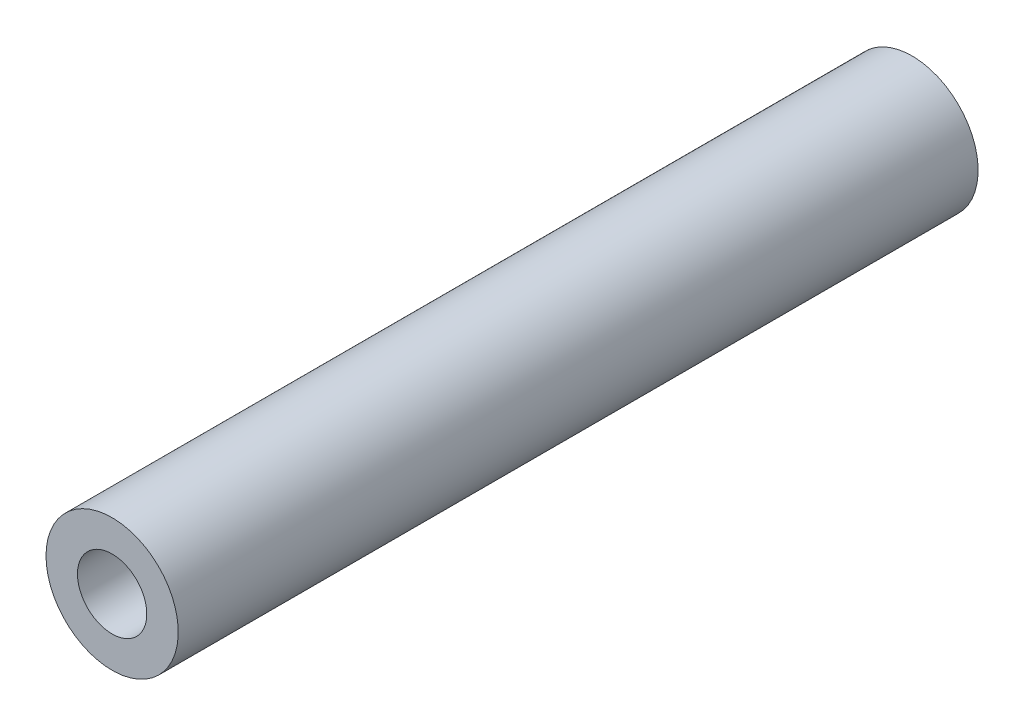
ISO-10303-21;
HEADER;
FILE_DESCRIPTION(('STEP AP214'),'2;1');
FILE_NAME('part.step','',(''),(''),'','','');
FILE_SCHEMA(('AUTOMOTIVE_DESIGN { 1 0 10303 214 1 1 1 1 }'));
ENDSEC;
DATA;
#1=APPLICATION_CONTEXT('core data for automotive mechanical design processes');
#2=APPLICATION_PROTOCOL_DEFINITION('international standard','automotive_design',2000,#1);
#3=PRODUCT_CONTEXT('',#1,'mechanical');
#4=PRODUCT('Part','Part','',(#3));
#5=PRODUCT_RELATED_PRODUCT_CATEGORY('part','',(#4));
#6=PRODUCT_DEFINITION_FORMATION('','',#4);
#7=PRODUCT_DEFINITION_CONTEXT('part definition',#1,'design');
#8=PRODUCT_DEFINITION('design','',#6,#7);
#9=PRODUCT_DEFINITION_SHAPE('','',#8);
#10=(LENGTH_UNIT() NAMED_UNIT(*) SI_UNIT(.MILLI.,.METRE.));
#11=(NAMED_UNIT(*) PLANE_ANGLE_UNIT() SI_UNIT($,.RADIAN.));
#12=(NAMED_UNIT(*) SI_UNIT($,.STERADIAN.) SOLID_ANGLE_UNIT());
#13=UNCERTAINTY_MEASURE_WITH_UNIT(LENGTH_MEASURE(1.E-05),#10,'distance_accuracy_value','');
#14=(GEOMETRIC_REPRESENTATION_CONTEXT(3) GLOBAL_UNCERTAINTY_ASSIGNED_CONTEXT((#13)) GLOBAL_UNIT_ASSIGNED_CONTEXT((#10,
#11,#12)) REPRESENTATION_CONTEXT('',''));
#15=CARTESIAN_POINT('',(0.,0.,0.));
#16=DIRECTION('',(0.,0.,1.));
#17=DIRECTION('',(1.,0.,0.));
#18=AXIS2_PLACEMENT_3D('',#15,#16,#17);
#19=CARTESIAN_POINT('',(0.,0.,19.05));
#20=DIRECTION('',(0.,0.,-1.));
#21=DIRECTION('',(-1.,0.,0.));
#22=AXIS2_PLACEMENT_3D('',#19,#20,#21);
#23=CYLINDRICAL_SURFACE('',#22,0.8255);
#24=CARTESIAN_POINT('',(0.,0.,19.05));
#25=DIRECTION('',(0.,0.,1.));
#26=DIRECTION('',(1.,0.,0.));
#27=AXIS2_PLACEMENT_3D('',#24,#25,#26);
#28=CIRCLE('',#27,0.8255);
#29=CARTESIAN_POINT('',(-0.8255,0.,19.05));
#30=VERTEX_POINT('',#29);
#31=EDGE_CURVE('E41',#30,#30,#28,.T.);
#32=CARTESIAN_POINT('',(0.,0.,0.));
#33=DIRECTION('',(0.,0.,1.));
#34=DIRECTION('',(1.,0.,0.));
#35=AXIS2_PLACEMENT_3D('',#32,#33,#34);
#36=CIRCLE('',#35,0.8255);
#37=CARTESIAN_POINT('',(-0.8255,0.,0.));
#38=VERTEX_POINT('',#37);
#39=EDGE_CURVE('E47',#38,#38,#36,.T.);
#40=CARTESIAN_POINT('',(-0.8255,0.,19.05));
#41=CARTESIAN_POINT('',(-0.8255,0.,18.8515625));
#42=CARTESIAN_POINT('',(-0.8255,0.,18.653125));
#43=CARTESIAN_POINT('',(-0.8255,0.,18.25625));
#44=CARTESIAN_POINT('',(-0.8255,0.,18.0578125));
#45=CARTESIAN_POINT('',(-0.8255,0.,17.6609375));
#46=CARTESIAN_POINT('',(-0.8255,0.,17.4625));
#47=CARTESIAN_POINT('',(-0.8255,0.,17.065625));
#48=CARTESIAN_POINT('',(-0.8255,0.,16.8671875));
#49=CARTESIAN_POINT('',(-0.8255,0.,16.4703125));
#50=CARTESIAN_POINT('',(-0.8255,0.,16.271875));
#51=CARTESIAN_POINT('',(-0.8255,0.,15.875));
#52=CARTESIAN_POINT('',(-0.8255,0.,15.6765625));
#53=CARTESIAN_POINT('',(-0.8255,0.,15.2796875));
#54=CARTESIAN_POINT('',(-0.8255,0.,15.08125));
#55=CARTESIAN_POINT('',(-0.8255,0.,14.684375));
#56=CARTESIAN_POINT('',(-0.8255,0.,14.4859375));
#57=CARTESIAN_POINT('',(-0.8255,0.,14.0890625));
#58=CARTESIAN_POINT('',(-0.8255,0.,13.890625));
#59=CARTESIAN_POINT('',(-0.8255,0.,13.49375));
#60=CARTESIAN_POINT('',(-0.8255,0.,13.2953125));
#61=CARTESIAN_POINT('',(-0.8255,0.,12.8984375));
#62=CARTESIAN_POINT('',(-0.8255,0.,12.7));
#63=CARTESIAN_POINT('',(-0.8255,0.,12.303125));
#64=CARTESIAN_POINT('',(-0.8255,0.,12.1046875));
#65=CARTESIAN_POINT('',(-0.8255,0.,11.7078125));
#66=CARTESIAN_POINT('',(-0.8255,0.,11.509375));
#67=CARTESIAN_POINT('',(-0.8255,0.,11.1125));
#68=CARTESIAN_POINT('',(-0.8255,0.,10.9140625));
#69=CARTESIAN_POINT('',(-0.8255,0.,10.5171875));
#70=CARTESIAN_POINT('',(-0.8255,0.,10.31875));
#71=CARTESIAN_POINT('',(-0.8255,0.,9.921875));
#72=CARTESIAN_POINT('',(-0.8255,0.,9.7234375));
#73=CARTESIAN_POINT('',(-0.8255,0.,9.3265625));
#74=CARTESIAN_POINT('',(-0.8255,0.,9.128125));
#75=CARTESIAN_POINT('',(-0.8255,0.,8.73125));
#76=CARTESIAN_POINT('',(-0.8255,0.,8.5328125));
#77=CARTESIAN_POINT('',(-0.8255,0.,8.1359375));
#78=CARTESIAN_POINT('',(-0.8255,0.,7.9375));
#79=CARTESIAN_POINT('',(-0.8255,0.,7.540625));
#80=CARTESIAN_POINT('',(-0.8255,0.,7.3421875));
#81=CARTESIAN_POINT('',(-0.8255,0.,6.9453125));
#82=CARTESIAN_POINT('',(-0.8255,0.,6.746875));
#83=CARTESIAN_POINT('',(-0.8255,0.,6.35));
#84=CARTESIAN_POINT('',(-0.8255,0.,6.1515625));
#85=CARTESIAN_POINT('',(-0.8255,0.,5.7546875));
#86=CARTESIAN_POINT('',(-0.8255,0.,5.55625));
#87=CARTESIAN_POINT('',(-0.8255,0.,5.159375));
#88=CARTESIAN_POINT('',(-0.8255,0.,4.9609375));
#89=CARTESIAN_POINT('',(-0.8255,0.,4.5640625));
#90=CARTESIAN_POINT('',(-0.8255,0.,4.365625));
#91=CARTESIAN_POINT('',(-0.8255,0.,3.96875));
#92=CARTESIAN_POINT('',(-0.8255,0.,3.7703125));
#93=CARTESIAN_POINT('',(-0.8255,0.,3.3734375));
#94=CARTESIAN_POINT('',(-0.8255,0.,3.175));
#95=CARTESIAN_POINT('',(-0.8255,0.,2.778125));
#96=CARTESIAN_POINT('',(-0.8255,0.,2.5796875));
#97=CARTESIAN_POINT('',(-0.8255,0.,2.1828125));
#98=CARTESIAN_POINT('',(-0.8255,0.,1.984375));
#99=CARTESIAN_POINT('',(-0.8255,0.,1.5875));
#100=CARTESIAN_POINT('',(-0.8255,0.,1.3890625));
#101=CARTESIAN_POINT('',(-0.8255,0.,0.992187500000001));
#102=CARTESIAN_POINT('',(-0.8255,0.,0.793750000000001));
#103=CARTESIAN_POINT('',(-0.8255,0.,0.396875));
#104=CARTESIAN_POINT('',(-0.8255,0.,0.1984375));
#105=CARTESIAN_POINT('',(-0.8255,0.,0.));
#106=B_SPLINE_CURVE_WITH_KNOTS('',3,(#40,#41,#42,#43,#44,#45,#46,#47,#48,#49,#50,#51,#52,#53,
#54,#55,#56,#57,#58,#59,#60,#61,#62,#63,#64,#65,#66,#67,#68,#69,#70,#71,#72,#73,#74,#75,#76,#77,
#78,#79,#80,#81,#82,#83,#84,#85,#86,#87,#88,#89,#90,#91,#92,#93,#94,#95,#96,#97,#98,#99,#100,
#101,#102,#103,#104,#105),.UNSPECIFIED.,.F.,.F.,(4,2,2,2,2,2,2,2,2,2,2,2,2,2,2,2,2,2,2,2,2,2,2,
2,2,2,2,2,2,2,2,2,4),(0.,0.5953125,1.190625,1.7859375,2.38125,2.9765625,3.571875,4.1671875,
4.7625,5.3578125,5.953125,6.5484375,7.14375,7.7390625,8.334375,8.9296875,9.525,10.1203125,
10.715625,11.3109375,11.90625,12.5015625,13.096875,13.6921875,14.2875,14.8828125,15.478125,
16.0734375,16.66875,17.2640625,17.859375,18.4546875,19.05),.UNSPECIFIED.);
#107=EDGE_CURVE('BSEAM34',#30,#38,#106,.T.);
#108=ORIENTED_EDGE('',*,*,#31,.T.);
#109=ORIENTED_EDGE('',*,*,#39,.F.);
#110=ORIENTED_EDGE('',*,*,#107,.T.);
#111=ORIENTED_EDGE('',*,*,#107,.F.);
#112=EDGE_LOOP('',(#108,#110,#109,#111));
#113=FACE_BOUND('',#112,.T.);
#114=ADVANCED_FACE('F34',(#113),#23,.F.);
#115=CARTESIAN_POINT('',(0.,0.,19.05));
#116=DIRECTION('',(0.,0.,-1.));
#117=DIRECTION('',(-1.,0.,0.));
#118=AXIS2_PLACEMENT_3D('',#115,#116,#117);
#119=CYLINDRICAL_SURFACE('',#118,1.5748);
#120=CARTESIAN_POINT('',(0.,0.,19.05));
#121=DIRECTION('',(0.,0.,1.));
#122=DIRECTION('',(1.,0.,0.));
#123=AXIS2_PLACEMENT_3D('',#120,#121,#122);
#124=CIRCLE('',#123,1.5748);
#125=CARTESIAN_POINT('',(-1.5748,0.,19.05));
#126=VERTEX_POINT('',#125);
#127=EDGE_CURVE('E10',#126,#126,#124,.T.);
#128=CARTESIAN_POINT('',(0.,0.,0.));
#129=DIRECTION('',(0.,0.,1.));
#130=DIRECTION('',(1.,0.,0.));
#131=AXIS2_PLACEMENT_3D('',#128,#129,#130);
#132=CIRCLE('',#131,1.5748);
#133=CARTESIAN_POINT('',(-1.5748,0.,0.));
#134=VERTEX_POINT('',#133);
#135=EDGE_CURVE('E37',#134,#134,#132,.T.);
#136=CARTESIAN_POINT('',(-1.5748,0.,19.05));
#137=CARTESIAN_POINT('',(-1.5748,0.,18.8515625));
#138=CARTESIAN_POINT('',(-1.5748,0.,18.653125));
#139=CARTESIAN_POINT('',(-1.5748,0.,18.25625));
#140=CARTESIAN_POINT('',(-1.5748,0.,18.0578125));
#141=CARTESIAN_POINT('',(-1.5748,0.,17.6609375));
#142=CARTESIAN_POINT('',(-1.5748,0.,17.4625));
#143=CARTESIAN_POINT('',(-1.5748,0.,17.065625));
#144=CARTESIAN_POINT('',(-1.5748,0.,16.8671875));
#145=CARTESIAN_POINT('',(-1.5748,0.,16.4703125));
#146=CARTESIAN_POINT('',(-1.5748,0.,16.271875));
#147=CARTESIAN_POINT('',(-1.5748,0.,15.875));
#148=CARTESIAN_POINT('',(-1.5748,0.,15.6765625));
#149=CARTESIAN_POINT('',(-1.5748,0.,15.2796875));
#150=CARTESIAN_POINT('',(-1.5748,0.,15.08125));
#151=CARTESIAN_POINT('',(-1.5748,0.,14.684375));
#152=CARTESIAN_POINT('',(-1.5748,0.,14.4859375));
#153=CARTESIAN_POINT('',(-1.5748,0.,14.0890625));
#154=CARTESIAN_POINT('',(-1.5748,0.,13.890625));
#155=CARTESIAN_POINT('',(-1.5748,0.,13.49375));
#156=CARTESIAN_POINT('',(-1.5748,0.,13.2953125));
#157=CARTESIAN_POINT('',(-1.5748,0.,12.8984375));
#158=CARTESIAN_POINT('',(-1.5748,0.,12.7));
#159=CARTESIAN_POINT('',(-1.5748,0.,12.303125));
#160=CARTESIAN_POINT('',(-1.5748,0.,12.1046875));
#161=CARTESIAN_POINT('',(-1.5748,0.,11.7078125));
#162=CARTESIAN_POINT('',(-1.5748,0.,11.509375));
#163=CARTESIAN_POINT('',(-1.5748,0.,11.1125));
#164=CARTESIAN_POINT('',(-1.5748,0.,10.9140625));
#165=CARTESIAN_POINT('',(-1.5748,0.,10.5171875));
#166=CARTESIAN_POINT('',(-1.5748,0.,10.31875));
#167=CARTESIAN_POINT('',(-1.5748,0.,9.921875));
#168=CARTESIAN_POINT('',(-1.5748,0.,9.7234375));
#169=CARTESIAN_POINT('',(-1.5748,0.,9.3265625));
#170=CARTESIAN_POINT('',(-1.5748,0.,9.128125));
#171=CARTESIAN_POINT('',(-1.5748,0.,8.73125));
#172=CARTESIAN_POINT('',(-1.5748,0.,8.5328125));
#173=CARTESIAN_POINT('',(-1.5748,0.,8.1359375));
#174=CARTESIAN_POINT('',(-1.5748,0.,7.9375));
#175=CARTESIAN_POINT('',(-1.5748,0.,7.540625));
#176=CARTESIAN_POINT('',(-1.5748,0.,7.3421875));
#177=CARTESIAN_POINT('',(-1.5748,0.,6.9453125));
#178=CARTESIAN_POINT('',(-1.5748,0.,6.746875));
#179=CARTESIAN_POINT('',(-1.5748,0.,6.35));
#180=CARTESIAN_POINT('',(-1.5748,0.,6.1515625));
#181=CARTESIAN_POINT('',(-1.5748,0.,5.7546875));
#182=CARTESIAN_POINT('',(-1.5748,0.,5.55625));
#183=CARTESIAN_POINT('',(-1.5748,0.,5.159375));
#184=CARTESIAN_POINT('',(-1.5748,0.,4.9609375));
#185=CARTESIAN_POINT('',(-1.5748,0.,4.5640625));
#186=CARTESIAN_POINT('',(-1.5748,0.,4.365625));
#187=CARTESIAN_POINT('',(-1.5748,0.,3.96875));
#188=CARTESIAN_POINT('',(-1.5748,0.,3.7703125));
#189=CARTESIAN_POINT('',(-1.5748,0.,3.3734375));
#190=CARTESIAN_POINT('',(-1.5748,0.,3.175));
#191=CARTESIAN_POINT('',(-1.5748,0.,2.778125));
#192=CARTESIAN_POINT('',(-1.5748,0.,2.5796875));
#193=CARTESIAN_POINT('',(-1.5748,0.,2.1828125));
#194=CARTESIAN_POINT('',(-1.5748,0.,1.984375));
#195=CARTESIAN_POINT('',(-1.5748,0.,1.5875));
#196=CARTESIAN_POINT('',(-1.5748,0.,1.3890625));
#197=CARTESIAN_POINT('',(-1.5748,0.,0.992187500000001));
#198=CARTESIAN_POINT('',(-1.5748,0.,0.793750000000001));
#199=CARTESIAN_POINT('',(-1.5748,0.,0.396875));
#200=CARTESIAN_POINT('',(-1.5748,0.,0.1984375));
#201=CARTESIAN_POINT('',(-1.5748,0.,0.));
#202=B_SPLINE_CURVE_WITH_KNOTS('',3,(#136,#137,#138,#139,#140,#141,#142,#143,#144,#145,#146,
#147,#148,#149,#150,#151,#152,#153,#154,#155,#156,#157,#158,#159,#160,#161,#162,#163,#164,#165,
#166,#167,#168,#169,#170,#171,#172,#173,#174,#175,#176,#177,#178,#179,#180,#181,#182,#183,#184,
#185,#186,#187,#188,#189,#190,#191,#192,#193,#194,#195,#196,#197,#198,#199,#200,#201),
.UNSPECIFIED.,.F.,.F.,(4,2,2,2,2,2,2,2,2,2,2,2,2,2,2,2,2,2,2,2,2,2,2,2,2,2,2,2,2,2,2,2,4),(0.,
0.595312499999997,1.190625,1.7859375,2.38125,2.9765625,3.571875,4.1671875,4.7625,5.3578125,
5.953125,6.5484375,7.14375,7.7390625,8.334375,8.9296875,9.525,10.1203125,10.715625,11.3109375,
11.90625,12.5015625,13.096875,13.6921875,14.2875,14.8828125,15.478125,16.0734375,16.66875,
17.2640625,17.859375,18.4546875,19.05),.UNSPECIFIED.);
#203=EDGE_CURVE('BSEAM54',#126,#134,#202,.T.);
#204=ORIENTED_EDGE('',*,*,#127,.F.);
#205=ORIENTED_EDGE('',*,*,#135,.T.);
#206=ORIENTED_EDGE('',*,*,#203,.T.);
#207=ORIENTED_EDGE('',*,*,#203,.F.);
#208=EDGE_LOOP('',(#204,#206,#205,#207));
#209=FACE_BOUND('',#208,.T.);
#210=ADVANCED_FACE('F54',(#209),#119,.T.);
#211=CARTESIAN_POINT('',(0.,-3.60598135623731,19.05));
#212=DIRECTION('',(0.,0.,1.));
#213=DIRECTION('',(1.,0.,0.));
#214=AXIS2_PLACEMENT_3D('',#211,#212,#213);
#215=PLANE('',#214);
#216=ORIENTED_EDGE('',*,*,#31,.F.);
#217=EDGE_LOOP('',(#216));
#218=FACE_BOUND('',#217,.T.);
#219=ORIENTED_EDGE('',*,*,#127,.T.);
#220=EDGE_LOOP('',(#219));
#221=FACE_BOUND('',#220,.T.);
#222=ADVANCED_FACE('F58',(#218,#221),#215,.T.);
#223=CARTESIAN_POINT('',(0.,-3.60598135623731,0.));
#224=DIRECTION('',(0.,0.,1.));
#225=DIRECTION('',(1.,0.,0.));
#226=AXIS2_PLACEMENT_3D('',#223,#224,#225);
#227=PLANE('',#226);
#228=ORIENTED_EDGE('',*,*,#39,.T.);
#229=EDGE_LOOP('',(#228));
#230=FACE_BOUND('',#229,.T.);
#231=ORIENTED_EDGE('',*,*,#135,.F.);
#232=EDGE_LOOP('',(#231));
#233=FACE_BOUND('',#232,.T.);
#234=ADVANCED_FACE('F56',(#230,#233),#227,.F.);
#235=CLOSED_SHELL('',(#114,#210,#222,#234));
#236=MANIFOLD_SOLID_BREP('B2',#235);
#237=ADVANCED_BREP_SHAPE_REPRESENTATION('',(#18,#236),#14);
#238=SHAPE_DEFINITION_REPRESENTATION(#9,#237);
ENDSEC;
END-ISO-10303-21;
